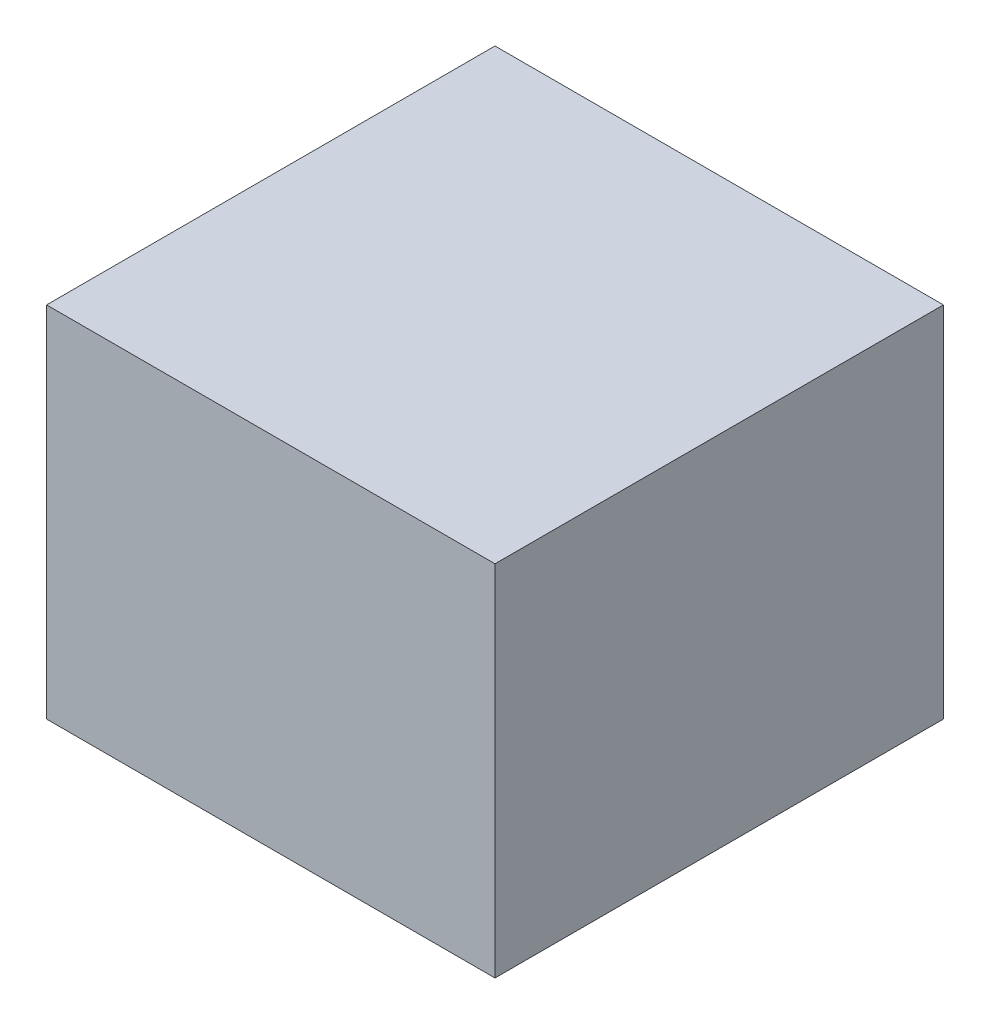
ISO-10303-21;
HEADER;
FILE_DESCRIPTION(('STEP AP214'),'2;1');
FILE_NAME('part.step','',(''),(''),'','','');
FILE_SCHEMA(('AUTOMOTIVE_DESIGN { 1 0 10303 214 1 1 1 1 }'));
ENDSEC;
DATA;
#1=APPLICATION_CONTEXT('core data for automotive mechanical design processes');
#2=APPLICATION_PROTOCOL_DEFINITION('international standard','automotive_design',2000,#1);
#3=PRODUCT_CONTEXT('',#1,'mechanical');
#4=PRODUCT('Part','Part','',(#3));
#5=PRODUCT_RELATED_PRODUCT_CATEGORY('part','',(#4));
#6=PRODUCT_DEFINITION_FORMATION('','',#4);
#7=PRODUCT_DEFINITION_CONTEXT('part definition',#1,'design');
#8=PRODUCT_DEFINITION('design','',#6,#7);
#9=PRODUCT_DEFINITION_SHAPE('','',#8);
#10=(LENGTH_UNIT() NAMED_UNIT(*) SI_UNIT(.MILLI.,.METRE.));
#11=(NAMED_UNIT(*) PLANE_ANGLE_UNIT() SI_UNIT($,.RADIAN.));
#12=(NAMED_UNIT(*) SI_UNIT($,.STERADIAN.) SOLID_ANGLE_UNIT());
#13=UNCERTAINTY_MEASURE_WITH_UNIT(LENGTH_MEASURE(1.E-05),#10,'distance_accuracy_value','');
#14=(GEOMETRIC_REPRESENTATION_CONTEXT(3) GLOBAL_UNCERTAINTY_ASSIGNED_CONTEXT((#13)) GLOBAL_UNIT_ASSIGNED_CONTEXT((#10,
#11,#12)) REPRESENTATION_CONTEXT('',''));
#15=CARTESIAN_POINT('',(0.,0.,0.));
#16=DIRECTION('',(0.,0.,1.));
#17=DIRECTION('',(1.,0.,0.));
#18=AXIS2_PLACEMENT_3D('',#15,#16,#17);
#19=CARTESIAN_POINT('',(0.,40.,0.));
#20=DIRECTION('',(1.,0.,0.));
#21=DIRECTION('',(0.,0.,-1.));
#22=AXIS2_PLACEMENT_3D('',#19,#20,#21);
#23=PLANE('',#22);
#24=DIRECTION('',(0.,0.,1.));
#25=VECTOR('',#24,1.);
#26=CARTESIAN_POINT('',(0.,0.,0.));
#27=LINE('',#26,#25);
#28=CARTESIAN_POINT('',(0.,0.,0.));
#29=VERTEX_POINT('',#28);
#30=CARTESIAN_POINT('',(0.,0.,50.));
#31=VERTEX_POINT('',#30);
#32=EDGE_CURVE('E107',#29,#31,#27,.T.);
#33=ORIENTED_EDGE('',*,*,#32,.T.);
#34=DIRECTION('',(0.,-1.,0.));
#35=VECTOR('',#34,1.);
#36=CARTESIAN_POINT('',(0.,40.,50.));
#37=LINE('',#36,#35);
#38=CARTESIAN_POINT('',(0.,40.,50.));
#39=VERTEX_POINT('',#38);
#40=EDGE_CURVE('E11',#39,#31,#37,.T.);
#41=ORIENTED_EDGE('',*,*,#40,.F.);
#42=DIRECTION('',(0.,0.,1.));
#43=VECTOR('',#42,1.);
#44=CARTESIAN_POINT('',(0.,40.,0.));
#45=LINE('',#44,#43);
#46=CARTESIAN_POINT('',(0.,40.,0.));
#47=VERTEX_POINT('',#46);
#48=EDGE_CURVE('E91',#47,#39,#45,.T.);
#49=ORIENTED_EDGE('',*,*,#48,.F.);
#50=DIRECTION('',(0.,-1.,0.));
#51=VECTOR('',#50,1.);
#52=CARTESIAN_POINT('',(0.,40.,0.));
#53=LINE('',#52,#51);
#54=EDGE_CURVE('E103',#47,#29,#53,.T.);
#55=ORIENTED_EDGE('',*,*,#54,.T.);
#56=EDGE_LOOP('',(#33,#41,#49,#55));
#57=FACE_BOUND('',#56,.T.);
#58=ADVANCED_FACE('F39',(#57),#23,.F.);
#59=CARTESIAN_POINT('',(0.,40.,50.));
#60=DIRECTION('',(0.,0.,-1.));
#61=DIRECTION('',(-1.,0.,0.));
#62=AXIS2_PLACEMENT_3D('',#59,#60,#61);
#63=PLANE('',#62);
#64=DIRECTION('',(1.,0.,0.));
#65=VECTOR('',#64,1.);
#66=CARTESIAN_POINT('',(0.,0.,50.));
#67=LINE('',#66,#65);
#68=CARTESIAN_POINT('',(50.,0.,50.));
#69=VERTEX_POINT('',#68);
#70=EDGE_CURVE('E96',#31,#69,#67,.T.);
#71=ORIENTED_EDGE('',*,*,#70,.T.);
#72=DIRECTION('',(0.,-1.,0.));
#73=VECTOR('',#72,1.);
#74=CARTESIAN_POINT('',(50.,40.,50.));
#75=LINE('',#74,#73);
#76=CARTESIAN_POINT('',(50.,40.,50.));
#77=VERTEX_POINT('',#76);
#78=EDGE_CURVE('E48',#77,#69,#75,.T.);
#79=ORIENTED_EDGE('',*,*,#78,.F.);
#80=DIRECTION('',(1.,0.,0.));
#81=VECTOR('',#80,1.);
#82=CARTESIAN_POINT('',(0.,40.,50.));
#83=LINE('',#82,#81);
#84=EDGE_CURVE('E86',#39,#77,#83,.T.);
#85=ORIENTED_EDGE('',*,*,#84,.F.);
#86=ORIENTED_EDGE('',*,*,#40,.T.);
#87=EDGE_LOOP('',(#71,#79,#85,#86));
#88=FACE_BOUND('',#87,.T.);
#89=ADVANCED_FACE('F95',(#88),#63,.F.);
#90=CARTESIAN_POINT('',(50.,40.,0.));
#91=DIRECTION('',(-1.,0.,0.));
#92=DIRECTION('',(0.,0.,1.));
#93=AXIS2_PLACEMENT_3D('',#90,#91,#92);
#94=PLANE('',#93);
#95=DIRECTION('',(0.,0.,-1.));
#96=VECTOR('',#95,1.);
#97=CARTESIAN_POINT('',(50.,0.,0.));
#98=LINE('',#97,#96);
#99=CARTESIAN_POINT('',(50.,0.,0.));
#100=VERTEX_POINT('',#99);
#101=EDGE_CURVE('E73',#69,#100,#98,.T.);
#102=ORIENTED_EDGE('',*,*,#101,.T.);
#103=DIRECTION('',(0.,-1.,0.));
#104=VECTOR('',#103,1.);
#105=CARTESIAN_POINT('',(50.,40.,0.));
#106=LINE('',#105,#104);
#107=CARTESIAN_POINT('',(50.,40.,0.));
#108=VERTEX_POINT('',#107);
#109=EDGE_CURVE('E98',#108,#100,#106,.T.);
#110=ORIENTED_EDGE('',*,*,#109,.F.);
#111=DIRECTION('',(0.,0.,-1.));
#112=VECTOR('',#111,1.);
#113=CARTESIAN_POINT('',(50.,40.,0.));
#114=LINE('',#113,#112);
#115=EDGE_CURVE('E89',#77,#108,#114,.T.);
#116=ORIENTED_EDGE('',*,*,#115,.F.);
#117=ORIENTED_EDGE('',*,*,#78,.T.);
#118=EDGE_LOOP('',(#102,#110,#116,#117));
#119=FACE_BOUND('',#118,.T.);
#120=ADVANCED_FACE('F99',(#119),#94,.F.);
#121=CARTESIAN_POINT('',(0.,40.,0.));
#122=DIRECTION('',(0.,0.,1.));
#123=DIRECTION('',(1.,0.,0.));
#124=AXIS2_PLACEMENT_3D('',#121,#122,#123);
#125=PLANE('',#124);
#126=DIRECTION('',(-1.,0.,0.));
#127=VECTOR('',#126,1.);
#128=CARTESIAN_POINT('',(0.,0.,0.));
#129=LINE('',#128,#127);
#130=EDGE_CURVE('E79',#100,#29,#129,.T.);
#131=ORIENTED_EDGE('',*,*,#130,.T.);
#132=ORIENTED_EDGE('',*,*,#54,.F.);
#133=DIRECTION('',(-1.,0.,0.));
#134=VECTOR('',#133,1.);
#135=CARTESIAN_POINT('',(0.,40.,0.));
#136=LINE('',#135,#134);
#137=EDGE_CURVE('E56',#108,#47,#136,.T.);
#138=ORIENTED_EDGE('',*,*,#137,.F.);
#139=ORIENTED_EDGE('',*,*,#109,.T.);
#140=EDGE_LOOP('',(#131,#132,#138,#139));
#141=FACE_BOUND('',#140,.T.);
#142=ADVANCED_FACE('F120',(#141),#125,.F.);
#143=CARTESIAN_POINT('',(0.,40.,0.));
#144=DIRECTION('',(0.,1.,0.));
#145=DIRECTION('',(0.,0.,1.));
#146=AXIS2_PLACEMENT_3D('',#143,#144,#145);
#147=PLANE('',#146);
#148=ORIENTED_EDGE('',*,*,#48,.T.);
#149=ORIENTED_EDGE('',*,*,#84,.T.);
#150=ORIENTED_EDGE('',*,*,#115,.T.);
#151=ORIENTED_EDGE('',*,*,#137,.T.);
#152=EDGE_LOOP('',(#148,#149,#150,#151));
#153=FACE_BOUND('',#152,.T.);
#154=ADVANCED_FACE('F87',(#153),#147,.T.);
#155=CARTESIAN_POINT('',(0.,0.,0.));
#156=DIRECTION('',(0.,1.,0.));
#157=DIRECTION('',(0.,0.,1.));
#158=AXIS2_PLACEMENT_3D('',#155,#156,#157);
#159=PLANE('',#158);
#160=ORIENTED_EDGE('',*,*,#32,.F.);
#161=ORIENTED_EDGE('',*,*,#130,.F.);
#162=ORIENTED_EDGE('',*,*,#101,.F.);
#163=ORIENTED_EDGE('',*,*,#70,.F.);
#164=EDGE_LOOP('',(#160,#161,#162,#163));
#165=FACE_BOUND('',#164,.T.);
#166=ADVANCED_FACE('F123',(#165),#159,.F.);
#167=CLOSED_SHELL('',(#58,#89,#120,#142,#154,#166));
#168=MANIFOLD_SOLID_BREP('B2',#167);
#169=ADVANCED_BREP_SHAPE_REPRESENTATION('',(#18,#168),#14);
#170=SHAPE_DEFINITION_REPRESENTATION(#9,#169);
ENDSEC;
END-ISO-10303-21;
